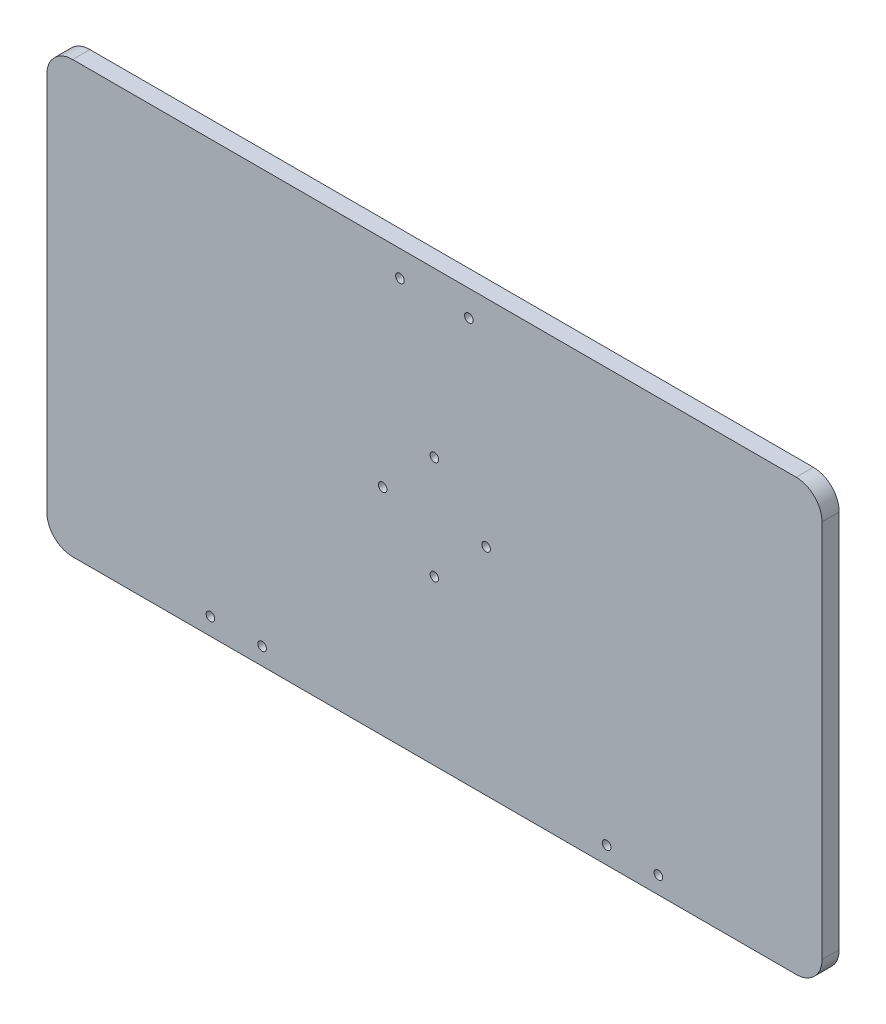
ISO-10303-21;
HEADER;
FILE_DESCRIPTION(('STEP AP214'),'2;1');
FILE_NAME('part.step','',(''),(''),'','','');
FILE_SCHEMA(('AUTOMOTIVE_DESIGN { 1 0 10303 214 1 1 1 1 }'));
ENDSEC;
DATA;
#1=APPLICATION_CONTEXT('core data for automotive mechanical design processes');
#2=APPLICATION_PROTOCOL_DEFINITION('international standard','automotive_design',2000,#1);
#3=PRODUCT_CONTEXT('',#1,'mechanical');
#4=PRODUCT('Part','Part','',(#3));
#5=PRODUCT_RELATED_PRODUCT_CATEGORY('part','',(#4));
#6=PRODUCT_DEFINITION_FORMATION('','',#4);
#7=PRODUCT_DEFINITION_CONTEXT('part definition',#1,'design');
#8=PRODUCT_DEFINITION('design','',#6,#7);
#9=PRODUCT_DEFINITION_SHAPE('','',#8);
#10=(LENGTH_UNIT() NAMED_UNIT(*) SI_UNIT(.MILLI.,.METRE.));
#11=(NAMED_UNIT(*) PLANE_ANGLE_UNIT() SI_UNIT($,.RADIAN.));
#12=(NAMED_UNIT(*) SI_UNIT($,.STERADIAN.) SOLID_ANGLE_UNIT());
#13=UNCERTAINTY_MEASURE_WITH_UNIT(LENGTH_MEASURE(1.E-05),#10,'distance_accuracy_value','');
#14=(GEOMETRIC_REPRESENTATION_CONTEXT(3) GLOBAL_UNCERTAINTY_ASSIGNED_CONTEXT((#13)) GLOBAL_UNIT_ASSIGNED_CONTEXT((#10,
#11,#12)) REPRESENTATION_CONTEXT('',''));
#15=CARTESIAN_POINT('',(0.,0.,0.));
#16=DIRECTION('',(0.,0.,1.));
#17=DIRECTION('',(1.,0.,0.));
#18=AXIS2_PLACEMENT_3D('',#15,#16,#17);
#19=CARTESIAN_POINT('',(435.,235.,10.));
#20=DIRECTION('',(0.,0.,-1.));
#21=DIRECTION('',(-1.,0.,0.));
#22=AXIS2_PLACEMENT_3D('',#19,#20,#21);
#23=PLANE('',#22);
#24=CARTESIAN_POINT('',(435.,235.,10.));
#25=DIRECTION('',(0.,0.,1.));
#26=DIRECTION('',(-1.,0.,0.));
#27=AXIS2_PLACEMENT_3D('',#24,#25,#26);
#28=CIRCLE('',#27,15.);
#29=CARTESIAN_POINT('',(450.,235.,10.));
#30=VERTEX_POINT('',#29);
#31=CARTESIAN_POINT('',(435.,250.,10.));
#32=VERTEX_POINT('',#31);
#33=EDGE_CURVE('E146',#30,#32,#28,.T.);
#34=ORIENTED_EDGE('',*,*,#33,.T.);
#35=DIRECTION('',(-1.,0.,0.));
#36=VECTOR('',#35,1.);
#37=CARTESIAN_POINT('',(15.,250.,10.));
#38=LINE('',#37,#36);
#39=CARTESIAN_POINT('',(15.,250.,10.));
#40=VERTEX_POINT('',#39);
#41=EDGE_CURVE('E94',#32,#40,#38,.T.);
#42=ORIENTED_EDGE('',*,*,#41,.T.);
#43=CARTESIAN_POINT('',(15.,235.,10.));
#44=DIRECTION('',(0.,0.,1.));
#45=DIRECTION('',(-1.,0.,0.));
#46=AXIS2_PLACEMENT_3D('',#43,#44,#45);
#47=CIRCLE('',#46,15.);
#48=CARTESIAN_POINT('',(0.,235.,10.));
#49=VERTEX_POINT('',#48);
#50=EDGE_CURVE('E161',#40,#49,#47,.T.);
#51=ORIENTED_EDGE('',*,*,#50,.T.);
#52=DIRECTION('',(0.,-1.,0.));
#53=VECTOR('',#52,1.);
#54=CARTESIAN_POINT('',(0.,15.0000000000001,10.));
#55=LINE('',#54,#53);
#56=CARTESIAN_POINT('',(0.,15.0000000000001,10.));
#57=VERTEX_POINT('',#56);
#58=EDGE_CURVE('E174',#49,#57,#55,.T.);
#59=ORIENTED_EDGE('',*,*,#58,.T.);
#60=CARTESIAN_POINT('',(15.,15.,10.));
#61=DIRECTION('',(0.,0.,1.));
#62=DIRECTION('',(-1.,0.,0.));
#63=AXIS2_PLACEMENT_3D('',#60,#61,#62);
#64=CIRCLE('',#63,15.);
#65=CARTESIAN_POINT('',(15.0000000000001,0.,10.));
#66=VERTEX_POINT('',#65);
#67=EDGE_CURVE('E113',#57,#66,#64,.T.);
#68=ORIENTED_EDGE('',*,*,#67,.T.);
#69=DIRECTION('',(1.,0.,0.));
#70=VECTOR('',#69,1.);
#71=CARTESIAN_POINT('',(15.0000000000001,0.,10.));
#72=LINE('',#71,#70);
#73=CARTESIAN_POINT('',(435.,0.,10.));
#74=VERTEX_POINT('',#73);
#75=EDGE_CURVE('E107',#66,#74,#72,.T.);
#76=ORIENTED_EDGE('',*,*,#75,.T.);
#77=CARTESIAN_POINT('',(435.,15.,10.));
#78=DIRECTION('',(0.,0.,1.));
#79=DIRECTION('',(1.,0.,0.));
#80=AXIS2_PLACEMENT_3D('',#77,#78,#79);
#81=CIRCLE('',#80,15.);
#82=CARTESIAN_POINT('',(450.,15.,10.));
#83=VERTEX_POINT('',#82);
#84=EDGE_CURVE('E111',#74,#83,#81,.T.);
#85=ORIENTED_EDGE('',*,*,#84,.T.);
#86=DIRECTION('',(0.,1.,0.));
#87=VECTOR('',#86,1.);
#88=CARTESIAN_POINT('',(450.,15.,10.));
#89=LINE('',#88,#87);
#90=EDGE_CURVE('E51',#83,#30,#89,.T.);
#91=ORIENTED_EDGE('',*,*,#90,.T.);
#92=EDGE_LOOP('',(#34,#42,#51,#59,#68,#76,#85,#91));
#93=FACE_BOUND('',#92,.T.);
#94=CARTESIAN_POINT('',(255.,125.,10.));
#95=DIRECTION('',(0.,0.,1.));
#96=DIRECTION('',(1.,0.,0.));
#97=AXIS2_PLACEMENT_3D('',#94,#95,#96);
#98=CIRCLE('',#97,2.50000000000002);
#99=CARTESIAN_POINT('',(257.5,125.,10.));
#100=VERTEX_POINT('',#99);
#101=EDGE_CURVE('E135',#100,#100,#98,.T.);
#102=ORIENTED_EDGE('',*,*,#101,.F.);
#103=EDGE_LOOP('',(#102));
#104=FACE_BOUND('',#103,.T.);
#105=CARTESIAN_POINT('',(225.,95.,10.));
#106=DIRECTION('',(0.,0.,1.));
#107=DIRECTION('',(1.,0.,0.));
#108=AXIS2_PLACEMENT_3D('',#105,#106,#107);
#109=CIRCLE('',#108,2.50000000000002);
#110=CARTESIAN_POINT('',(227.5,95.,10.));
#111=VERTEX_POINT('',#110);
#112=EDGE_CURVE('E183',#111,#111,#109,.T.);
#113=ORIENTED_EDGE('',*,*,#112,.F.);
#114=EDGE_LOOP('',(#113));
#115=FACE_BOUND('',#114,.T.);
#116=CARTESIAN_POINT('',(195.,125.,10.));
#117=DIRECTION('',(0.,0.,1.));
#118=DIRECTION('',(1.,0.,0.));
#119=AXIS2_PLACEMENT_3D('',#116,#117,#118);
#120=CIRCLE('',#119,2.50000000000001);
#121=CARTESIAN_POINT('',(197.5,125.,10.));
#122=VERTEX_POINT('',#121);
#123=EDGE_CURVE('E189',#122,#122,#120,.T.);
#124=ORIENTED_EDGE('',*,*,#123,.F.);
#125=EDGE_LOOP('',(#124));
#126=FACE_BOUND('',#125,.T.);
#127=CARTESIAN_POINT('',(225.,155.,10.));
#128=DIRECTION('',(0.,0.,1.));
#129=DIRECTION('',(1.,0.,0.));
#130=AXIS2_PLACEMENT_3D('',#127,#128,#129);
#131=CIRCLE('',#130,2.50000000000001);
#132=CARTESIAN_POINT('',(227.5,155.,10.));
#133=VERTEX_POINT('',#132);
#134=EDGE_CURVE('E195',#133,#133,#131,.T.);
#135=ORIENTED_EDGE('',*,*,#134,.F.);
#136=EDGE_LOOP('',(#135));
#137=FACE_BOUND('',#136,.T.);
#138=CARTESIAN_POINT('',(125.,10.,10.));
#139=DIRECTION('',(0.,0.,1.));
#140=DIRECTION('',(1.,0.,0.));
#141=AXIS2_PLACEMENT_3D('',#138,#139,#140);
#142=CIRCLE('',#141,2.5);
#143=CARTESIAN_POINT('',(127.5,10.,10.));
#144=VERTEX_POINT('',#143);
#145=EDGE_CURVE('E201',#144,#144,#142,.T.);
#146=ORIENTED_EDGE('',*,*,#145,.F.);
#147=EDGE_LOOP('',(#146));
#148=FACE_BOUND('',#147,.T.);
#149=CARTESIAN_POINT('',(95.,10.,10.));
#150=DIRECTION('',(0.,0.,1.));
#151=DIRECTION('',(1.,0.,0.));
#152=AXIS2_PLACEMENT_3D('',#149,#150,#151);
#153=CIRCLE('',#152,2.5);
#154=CARTESIAN_POINT('',(97.5,10.,10.));
#155=VERTEX_POINT('',#154);
#156=EDGE_CURVE('E207',#155,#155,#153,.T.);
#157=ORIENTED_EDGE('',*,*,#156,.F.);
#158=EDGE_LOOP('',(#157));
#159=FACE_BOUND('',#158,.T.);
#160=CARTESIAN_POINT('',(355.,10.0000000000001,10.));
#161=DIRECTION('',(0.,0.,1.));
#162=DIRECTION('',(-1.,0.,0.));
#163=AXIS2_PLACEMENT_3D('',#160,#161,#162);
#164=CIRCLE('',#163,2.50000000000002);
#165=CARTESIAN_POINT('',(352.5,10.0000000000001,10.));
#166=VERTEX_POINT('',#165);
#167=EDGE_CURVE('E213',#166,#166,#164,.T.);
#168=ORIENTED_EDGE('',*,*,#167,.F.);
#169=EDGE_LOOP('',(#168));
#170=FACE_BOUND('',#169,.T.);
#171=CARTESIAN_POINT('',(325.,10.0000000000001,10.));
#172=DIRECTION('',(0.,0.,1.));
#173=DIRECTION('',(-1.,0.,0.));
#174=AXIS2_PLACEMENT_3D('',#171,#172,#173);
#175=CIRCLE('',#174,2.50000000000002);
#176=CARTESIAN_POINT('',(322.5,10.0000000000001,10.));
#177=VERTEX_POINT('',#176);
#178=EDGE_CURVE('E219',#177,#177,#175,.T.);
#179=ORIENTED_EDGE('',*,*,#178,.F.);
#180=EDGE_LOOP('',(#179));
#181=FACE_BOUND('',#180,.T.);
#182=CARTESIAN_POINT('',(245.,235.,10.));
#183=DIRECTION('',(0.,0.,1.));
#184=DIRECTION('',(1.,0.,0.));
#185=AXIS2_PLACEMENT_3D('',#182,#183,#184);
#186=CIRCLE('',#185,2.5);
#187=CARTESIAN_POINT('',(247.5,235.,10.));
#188=VERTEX_POINT('',#187);
#189=EDGE_CURVE('E225',#188,#188,#186,.T.);
#190=ORIENTED_EDGE('',*,*,#189,.F.);
#191=EDGE_LOOP('',(#190));
#192=FACE_BOUND('',#191,.T.);
#193=CARTESIAN_POINT('',(205.,235.,10.));
#194=DIRECTION('',(0.,0.,1.));
#195=DIRECTION('',(1.,0.,0.));
#196=AXIS2_PLACEMENT_3D('',#193,#194,#195);
#197=CIRCLE('',#196,2.5);
#198=CARTESIAN_POINT('',(207.5,235.,10.));
#199=VERTEX_POINT('',#198);
#200=EDGE_CURVE('E231',#199,#199,#197,.T.);
#201=ORIENTED_EDGE('',*,*,#200,.F.);
#202=EDGE_LOOP('',(#201));
#203=FACE_BOUND('',#202,.T.);
#204=ADVANCED_FACE('F34',(#93,#104,#115,#126,#137,#148,#159,#170,#181,#192,#203),#23,.F.);
#205=CARTESIAN_POINT('',(435.,235.,0.));
#206=DIRECTION('',(0.,0.,-1.));
#207=DIRECTION('',(-1.,0.,0.));
#208=AXIS2_PLACEMENT_3D('',#205,#206,#207);
#209=PLANE('',#208);
#210=CARTESIAN_POINT('',(245.,235.,0.));
#211=DIRECTION('',(0.,0.,1.));
#212=DIRECTION('',(1.,0.,0.));
#213=AXIS2_PLACEMENT_3D('',#210,#211,#212);
#214=CIRCLE('',#213,2.5);
#215=CARTESIAN_POINT('',(247.5,235.,0.));
#216=VERTEX_POINT('',#215);
#217=EDGE_CURVE('E228',#216,#216,#214,.T.);
#218=ORIENTED_EDGE('',*,*,#217,.T.);
#219=EDGE_LOOP('',(#218));
#220=FACE_BOUND('',#219,.T.);
#221=CARTESIAN_POINT('',(355.,10.0000000000001,0.));
#222=DIRECTION('',(0.,0.,1.));
#223=DIRECTION('',(-1.,0.,0.));
#224=AXIS2_PLACEMENT_3D('',#221,#222,#223);
#225=CIRCLE('',#224,2.50000000000002);
#226=CARTESIAN_POINT('',(352.5,10.0000000000001,0.));
#227=VERTEX_POINT('',#226);
#228=EDGE_CURVE('E216',#227,#227,#225,.T.);
#229=ORIENTED_EDGE('',*,*,#228,.T.);
#230=EDGE_LOOP('',(#229));
#231=FACE_BOUND('',#230,.T.);
#232=CARTESIAN_POINT('',(125.,10.,0.));
#233=DIRECTION('',(0.,0.,1.));
#234=DIRECTION('',(1.,0.,0.));
#235=AXIS2_PLACEMENT_3D('',#232,#233,#234);
#236=CIRCLE('',#235,2.5);
#237=CARTESIAN_POINT('',(127.5,10.,0.));
#238=VERTEX_POINT('',#237);
#239=EDGE_CURVE('E204',#238,#238,#236,.T.);
#240=ORIENTED_EDGE('',*,*,#239,.T.);
#241=EDGE_LOOP('',(#240));
#242=FACE_BOUND('',#241,.T.);
#243=CARTESIAN_POINT('',(195.,125.,0.));
#244=DIRECTION('',(0.,0.,1.));
#245=DIRECTION('',(1.,0.,0.));
#246=AXIS2_PLACEMENT_3D('',#243,#244,#245);
#247=CIRCLE('',#246,2.50000000000001);
#248=CARTESIAN_POINT('',(197.5,125.,0.));
#249=VERTEX_POINT('',#248);
#250=EDGE_CURVE('E192',#249,#249,#247,.T.);
#251=ORIENTED_EDGE('',*,*,#250,.T.);
#252=EDGE_LOOP('',(#251));
#253=FACE_BOUND('',#252,.T.);
#254=CARTESIAN_POINT('',(255.,125.,0.));
#255=DIRECTION('',(0.,0.,1.));
#256=DIRECTION('',(1.,0.,0.));
#257=AXIS2_PLACEMENT_3D('',#254,#255,#256);
#258=CIRCLE('',#257,2.50000000000002);
#259=CARTESIAN_POINT('',(257.5,125.,0.));
#260=VERTEX_POINT('',#259);
#261=EDGE_CURVE('E180',#260,#260,#258,.T.);
#262=ORIENTED_EDGE('',*,*,#261,.T.);
#263=EDGE_LOOP('',(#262));
#264=FACE_BOUND('',#263,.T.);
#265=CARTESIAN_POINT('',(435.,235.,0.));
#266=DIRECTION('',(0.,0.,1.));
#267=DIRECTION('',(-1.,0.,0.));
#268=AXIS2_PLACEMENT_3D('',#265,#266,#267);
#269=CIRCLE('',#268,15.);
#270=CARTESIAN_POINT('',(450.,235.,0.));
#271=VERTEX_POINT('',#270);
#272=CARTESIAN_POINT('',(435.,250.,0.));
#273=VERTEX_POINT('',#272);
#274=EDGE_CURVE('E131',#271,#273,#269,.T.);
#275=ORIENTED_EDGE('',*,*,#274,.F.);
#276=DIRECTION('',(0.,1.,0.));
#277=VECTOR('',#276,1.);
#278=CARTESIAN_POINT('',(450.,15.,0.));
#279=LINE('',#278,#277);
#280=CARTESIAN_POINT('',(450.,15.,0.));
#281=VERTEX_POINT('',#280);
#282=EDGE_CURVE('E86',#281,#271,#279,.T.);
#283=ORIENTED_EDGE('',*,*,#282,.F.);
#284=CARTESIAN_POINT('',(435.,15.,0.));
#285=DIRECTION('',(0.,0.,1.));
#286=DIRECTION('',(1.,0.,0.));
#287=AXIS2_PLACEMENT_3D('',#284,#285,#286);
#288=CIRCLE('',#287,15.);
#289=CARTESIAN_POINT('',(435.,0.,0.));
#290=VERTEX_POINT('',#289);
#291=EDGE_CURVE('E80',#290,#281,#288,.T.);
#292=ORIENTED_EDGE('',*,*,#291,.F.);
#293=DIRECTION('',(1.,0.,0.));
#294=VECTOR('',#293,1.);
#295=CARTESIAN_POINT('',(15.0000000000001,0.,0.));
#296=LINE('',#295,#294);
#297=CARTESIAN_POINT('',(15.0000000000001,0.,0.));
#298=VERTEX_POINT('',#297);
#299=EDGE_CURVE('E121',#298,#290,#296,.T.);
#300=ORIENTED_EDGE('',*,*,#299,.F.);
#301=CARTESIAN_POINT('',(15.,15.,0.));
#302=DIRECTION('',(0.,0.,1.));
#303=DIRECTION('',(-1.,0.,0.));
#304=AXIS2_PLACEMENT_3D('',#301,#302,#303);
#305=CIRCLE('',#304,15.);
#306=CARTESIAN_POINT('',(0.,15.0000000000001,0.));
#307=VERTEX_POINT('',#306);
#308=EDGE_CURVE('E141',#307,#298,#305,.T.);
#309=ORIENTED_EDGE('',*,*,#308,.F.);
#310=DIRECTION('',(0.,-1.,0.));
#311=VECTOR('',#310,1.);
#312=CARTESIAN_POINT('',(0.,15.0000000000001,0.));
#313=LINE('',#312,#311);
#314=CARTESIAN_POINT('',(0.,235.,0.));
#315=VERTEX_POINT('',#314);
#316=EDGE_CURVE('E139',#315,#307,#313,.T.);
#317=ORIENTED_EDGE('',*,*,#316,.F.);
#318=CARTESIAN_POINT('',(15.,235.,0.));
#319=DIRECTION('',(0.,0.,1.));
#320=DIRECTION('',(-1.,0.,0.));
#321=AXIS2_PLACEMENT_3D('',#318,#319,#320);
#322=CIRCLE('',#321,15.);
#323=CARTESIAN_POINT('',(15.,250.,0.));
#324=VERTEX_POINT('',#323);
#325=EDGE_CURVE('E137',#324,#315,#322,.T.);
#326=ORIENTED_EDGE('',*,*,#325,.F.);
#327=DIRECTION('',(-1.,0.,0.));
#328=VECTOR('',#327,1.);
#329=CARTESIAN_POINT('',(15.,250.,0.));
#330=LINE('',#329,#328);
#331=EDGE_CURVE('E134',#273,#324,#330,.T.);
#332=ORIENTED_EDGE('',*,*,#331,.F.);
#333=EDGE_LOOP('',(#275,#283,#292,#300,#309,#317,#326,#332));
#334=FACE_BOUND('',#333,.T.);
#335=CARTESIAN_POINT('',(225.,95.,0.));
#336=DIRECTION('',(0.,0.,1.));
#337=DIRECTION('',(1.,0.,0.));
#338=AXIS2_PLACEMENT_3D('',#335,#336,#337);
#339=CIRCLE('',#338,2.50000000000002);
#340=CARTESIAN_POINT('',(227.5,95.,0.));
#341=VERTEX_POINT('',#340);
#342=EDGE_CURVE('E186',#341,#341,#339,.T.);
#343=ORIENTED_EDGE('',*,*,#342,.T.);
#344=EDGE_LOOP('',(#343));
#345=FACE_BOUND('',#344,.T.);
#346=CARTESIAN_POINT('',(225.,155.,0.));
#347=DIRECTION('',(0.,0.,1.));
#348=DIRECTION('',(1.,0.,0.));
#349=AXIS2_PLACEMENT_3D('',#346,#347,#348);
#350=CIRCLE('',#349,2.50000000000001);
#351=CARTESIAN_POINT('',(227.5,155.,0.));
#352=VERTEX_POINT('',#351);
#353=EDGE_CURVE('E198',#352,#352,#350,.T.);
#354=ORIENTED_EDGE('',*,*,#353,.T.);
#355=EDGE_LOOP('',(#354));
#356=FACE_BOUND('',#355,.T.);
#357=CARTESIAN_POINT('',(95.,10.,0.));
#358=DIRECTION('',(0.,0.,1.));
#359=DIRECTION('',(1.,0.,0.));
#360=AXIS2_PLACEMENT_3D('',#357,#358,#359);
#361=CIRCLE('',#360,2.5);
#362=CARTESIAN_POINT('',(97.5,10.,0.));
#363=VERTEX_POINT('',#362);
#364=EDGE_CURVE('E210',#363,#363,#361,.T.);
#365=ORIENTED_EDGE('',*,*,#364,.T.);
#366=EDGE_LOOP('',(#365));
#367=FACE_BOUND('',#366,.T.);
#368=CARTESIAN_POINT('',(325.,10.0000000000001,0.));
#369=DIRECTION('',(0.,0.,1.));
#370=DIRECTION('',(-1.,0.,0.));
#371=AXIS2_PLACEMENT_3D('',#368,#369,#370);
#372=CIRCLE('',#371,2.50000000000002);
#373=CARTESIAN_POINT('',(322.5,10.0000000000001,0.));
#374=VERTEX_POINT('',#373);
#375=EDGE_CURVE('E222',#374,#374,#372,.T.);
#376=ORIENTED_EDGE('',*,*,#375,.T.);
#377=EDGE_LOOP('',(#376));
#378=FACE_BOUND('',#377,.T.);
#379=CARTESIAN_POINT('',(205.,235.,0.));
#380=DIRECTION('',(0.,0.,1.));
#381=DIRECTION('',(1.,0.,0.));
#382=AXIS2_PLACEMENT_3D('',#379,#380,#381);
#383=CIRCLE('',#382,2.5);
#384=CARTESIAN_POINT('',(207.5,235.,0.));
#385=VERTEX_POINT('',#384);
#386=EDGE_CURVE('E234',#385,#385,#383,.T.);
#387=ORIENTED_EDGE('',*,*,#386,.T.);
#388=EDGE_LOOP('',(#387));
#389=FACE_BOUND('',#388,.T.);
#390=ADVANCED_FACE('F165',(#220,#231,#242,#253,#264,#334,#345,#356,#367,#378,#389),#209,.T.);
#391=CARTESIAN_POINT('',(435.,235.,10.));
#392=DIRECTION('',(0.,0.,-1.));
#393=DIRECTION('',(-1.,0.,0.));
#394=AXIS2_PLACEMENT_3D('',#391,#392,#393);
#395=CYLINDRICAL_SURFACE('',#394,15.);
#396=ORIENTED_EDGE('',*,*,#274,.T.);
#397=DIRECTION('',(0.,0.,-1.));
#398=VECTOR('',#397,1.);
#399=CARTESIAN_POINT('',(435.,250.,10.));
#400=LINE('',#399,#398);
#401=EDGE_CURVE('E11',#32,#273,#400,.T.);
#402=ORIENTED_EDGE('',*,*,#401,.F.);
#403=ORIENTED_EDGE('',*,*,#33,.F.);
#404=DIRECTION('',(0.,0.,-1.));
#405=VECTOR('',#404,1.);
#406=CARTESIAN_POINT('',(450.,235.,10.));
#407=LINE('',#406,#405);
#408=EDGE_CURVE('E127',#30,#271,#407,.T.);
#409=ORIENTED_EDGE('',*,*,#408,.T.);
#410=EDGE_LOOP('',(#396,#402,#403,#409));
#411=FACE_BOUND('',#410,.T.);
#412=ADVANCED_FACE('F36',(#411),#395,.T.);
#413=CARTESIAN_POINT('',(15.,250.,10.));
#414=DIRECTION('',(0.,-1.,0.));
#415=DIRECTION('',(0.,0.,-1.));
#416=AXIS2_PLACEMENT_3D('',#413,#414,#415);
#417=PLANE('',#416);
#418=ORIENTED_EDGE('',*,*,#331,.T.);
#419=DIRECTION('',(0.,0.,-1.));
#420=VECTOR('',#419,1.);
#421=CARTESIAN_POINT('',(15.,250.,10.));
#422=LINE('',#421,#420);
#423=EDGE_CURVE('E43',#40,#324,#422,.T.);
#424=ORIENTED_EDGE('',*,*,#423,.F.);
#425=ORIENTED_EDGE('',*,*,#41,.F.);
#426=ORIENTED_EDGE('',*,*,#401,.T.);
#427=EDGE_LOOP('',(#418,#424,#425,#426));
#428=FACE_BOUND('',#427,.T.);
#429=ADVANCED_FACE('F266',(#428),#417,.F.);
#430=CARTESIAN_POINT('',(15.,235.,10.));
#431=DIRECTION('',(0.,0.,-1.));
#432=DIRECTION('',(-1.,0.,0.));
#433=AXIS2_PLACEMENT_3D('',#430,#431,#432);
#434=CYLINDRICAL_SURFACE('',#433,15.);
#435=ORIENTED_EDGE('',*,*,#325,.T.);
#436=DIRECTION('',(0.,0.,-1.));
#437=VECTOR('',#436,1.);
#438=CARTESIAN_POINT('',(0.,235.,10.));
#439=LINE('',#438,#437);
#440=EDGE_CURVE('E153',#49,#315,#439,.T.);
#441=ORIENTED_EDGE('',*,*,#440,.F.);
#442=ORIENTED_EDGE('',*,*,#50,.F.);
#443=ORIENTED_EDGE('',*,*,#423,.T.);
#444=EDGE_LOOP('',(#435,#441,#442,#443));
#445=FACE_BOUND('',#444,.T.);
#446=ADVANCED_FACE('F159',(#445),#434,.T.);
#447=CARTESIAN_POINT('',(0.,15.0000000000001,10.));
#448=DIRECTION('',(1.,0.,0.));
#449=DIRECTION('',(0.,0.,-1.));
#450=AXIS2_PLACEMENT_3D('',#447,#448,#449);
#451=PLANE('',#450);
#452=ORIENTED_EDGE('',*,*,#316,.T.);
#453=DIRECTION('',(0.,0.,-1.));
#454=VECTOR('',#453,1.);
#455=CARTESIAN_POINT('',(0.,15.0000000000001,10.));
#456=LINE('',#455,#454);
#457=EDGE_CURVE('E150',#57,#307,#456,.T.);
#458=ORIENTED_EDGE('',*,*,#457,.F.);
#459=ORIENTED_EDGE('',*,*,#58,.F.);
#460=ORIENTED_EDGE('',*,*,#440,.T.);
#461=EDGE_LOOP('',(#452,#458,#459,#460));
#462=FACE_BOUND('',#461,.T.);
#463=ADVANCED_FACE('F170',(#462),#451,.F.);
#464=CARTESIAN_POINT('',(15.,15.,10.));
#465=DIRECTION('',(0.,0.,-1.));
#466=DIRECTION('',(-1.,0.,0.));
#467=AXIS2_PLACEMENT_3D('',#464,#465,#466);
#468=CYLINDRICAL_SURFACE('',#467,15.);
#469=ORIENTED_EDGE('',*,*,#308,.T.);
#470=DIRECTION('',(0.,0.,-1.));
#471=VECTOR('',#470,1.);
#472=CARTESIAN_POINT('',(15.0000000000001,0.,10.));
#473=LINE('',#472,#471);
#474=EDGE_CURVE('E122',#66,#298,#473,.T.);
#475=ORIENTED_EDGE('',*,*,#474,.F.);
#476=ORIENTED_EDGE('',*,*,#67,.F.);
#477=ORIENTED_EDGE('',*,*,#457,.T.);
#478=EDGE_LOOP('',(#469,#475,#476,#477));
#479=FACE_BOUND('',#478,.T.);
#480=ADVANCED_FACE('F173',(#479),#468,.T.);
#481=CARTESIAN_POINT('',(15.0000000000001,0.,10.));
#482=DIRECTION('',(0.,1.,0.));
#483=DIRECTION('',(-1.,0.,0.));
#484=AXIS2_PLACEMENT_3D('',#481,#482,#483);
#485=PLANE('',#484);
#486=ORIENTED_EDGE('',*,*,#299,.T.);
#487=DIRECTION('',(0.,0.,-1.));
#488=VECTOR('',#487,1.);
#489=CARTESIAN_POINT('',(435.,0.,10.));
#490=LINE('',#489,#488);
#491=EDGE_CURVE('E118',#74,#290,#490,.T.);
#492=ORIENTED_EDGE('',*,*,#491,.F.);
#493=ORIENTED_EDGE('',*,*,#75,.F.);
#494=ORIENTED_EDGE('',*,*,#474,.T.);
#495=EDGE_LOOP('',(#486,#492,#493,#494));
#496=FACE_BOUND('',#495,.T.);
#497=ADVANCED_FACE('F119',(#496),#485,.F.);
#498=CARTESIAN_POINT('',(435.,15.,10.));
#499=DIRECTION('',(0.,0.,-1.));
#500=DIRECTION('',(-1.,0.,0.));
#501=AXIS2_PLACEMENT_3D('',#498,#499,#500);
#502=CYLINDRICAL_SURFACE('',#501,15.);
#503=ORIENTED_EDGE('',*,*,#291,.T.);
#504=DIRECTION('',(0.,0.,-1.));
#505=VECTOR('',#504,1.);
#506=CARTESIAN_POINT('',(450.,15.,10.));
#507=LINE('',#506,#505);
#508=EDGE_CURVE('E123',#83,#281,#507,.T.);
#509=ORIENTED_EDGE('',*,*,#508,.F.);
#510=ORIENTED_EDGE('',*,*,#84,.F.);
#511=ORIENTED_EDGE('',*,*,#491,.T.);
#512=EDGE_LOOP('',(#503,#509,#510,#511));
#513=FACE_BOUND('',#512,.T.);
#514=ADVANCED_FACE('F125',(#513),#502,.T.);
#515=CARTESIAN_POINT('',(450.,15.,10.));
#516=DIRECTION('',(-1.,0.,0.));
#517=DIRECTION('',(0.,0.,1.));
#518=AXIS2_PLACEMENT_3D('',#515,#516,#517);
#519=PLANE('',#518);
#520=ORIENTED_EDGE('',*,*,#282,.T.);
#521=ORIENTED_EDGE('',*,*,#408,.F.);
#522=ORIENTED_EDGE('',*,*,#90,.F.);
#523=ORIENTED_EDGE('',*,*,#508,.T.);
#524=EDGE_LOOP('',(#520,#521,#522,#523));
#525=FACE_BOUND('',#524,.T.);
#526=ADVANCED_FACE('F254',(#525),#519,.F.);
#527=CARTESIAN_POINT('',(255.,125.,10.));
#528=DIRECTION('',(0.,0.,-1.));
#529=DIRECTION('',(-1.,0.,0.));
#530=AXIS2_PLACEMENT_3D('',#527,#528,#529);
#531=CYLINDRICAL_SURFACE('',#530,2.50000000000002);
#532=ORIENTED_EDGE('',*,*,#101,.T.);
#533=EDGE_LOOP('',(#532));
#534=FACE_BOUND('',#533,.T.);
#535=ORIENTED_EDGE('',*,*,#261,.F.);
#536=EDGE_LOOP('',(#535));
#537=FACE_BOUND('',#536,.T.);
#538=ADVANCED_FACE('F251',(#534,#537),#531,.F.);
#539=CARTESIAN_POINT('',(225.,95.,10.));
#540=DIRECTION('',(0.,0.,-1.));
#541=DIRECTION('',(-1.,0.,0.));
#542=AXIS2_PLACEMENT_3D('',#539,#540,#541);
#543=CYLINDRICAL_SURFACE('',#542,2.50000000000002);
#544=ORIENTED_EDGE('',*,*,#112,.T.);
#545=EDGE_LOOP('',(#544));
#546=FACE_BOUND('',#545,.T.);
#547=ORIENTED_EDGE('',*,*,#342,.F.);
#548=EDGE_LOOP('',(#547));
#549=FACE_BOUND('',#548,.T.);
#550=ADVANCED_FACE('F330',(#546,#549),#543,.F.);
#551=CARTESIAN_POINT('',(195.,125.,10.));
#552=DIRECTION('',(0.,0.,-1.));
#553=DIRECTION('',(-1.,0.,0.));
#554=AXIS2_PLACEMENT_3D('',#551,#552,#553);
#555=CYLINDRICAL_SURFACE('',#554,2.50000000000001);
#556=ORIENTED_EDGE('',*,*,#123,.T.);
#557=EDGE_LOOP('',(#556));
#558=FACE_BOUND('',#557,.T.);
#559=ORIENTED_EDGE('',*,*,#250,.F.);
#560=EDGE_LOOP('',(#559));
#561=FACE_BOUND('',#560,.T.);
#562=ADVANCED_FACE('F338',(#558,#561),#555,.F.);
#563=CARTESIAN_POINT('',(225.,155.,10.));
#564=DIRECTION('',(0.,0.,-1.));
#565=DIRECTION('',(-1.,0.,0.));
#566=AXIS2_PLACEMENT_3D('',#563,#564,#565);
#567=CYLINDRICAL_SURFACE('',#566,2.50000000000001);
#568=ORIENTED_EDGE('',*,*,#134,.T.);
#569=EDGE_LOOP('',(#568));
#570=FACE_BOUND('',#569,.T.);
#571=ORIENTED_EDGE('',*,*,#353,.F.);
#572=EDGE_LOOP('',(#571));
#573=FACE_BOUND('',#572,.T.);
#574=ADVANCED_FACE('F346',(#570,#573),#567,.F.);
#575=CARTESIAN_POINT('',(125.,10.,10.));
#576=DIRECTION('',(0.,0.,-1.));
#577=DIRECTION('',(-1.,0.,0.));
#578=AXIS2_PLACEMENT_3D('',#575,#576,#577);
#579=CYLINDRICAL_SURFACE('',#578,2.5);
#580=ORIENTED_EDGE('',*,*,#145,.T.);
#581=EDGE_LOOP('',(#580));
#582=FACE_BOUND('',#581,.T.);
#583=ORIENTED_EDGE('',*,*,#239,.F.);
#584=EDGE_LOOP('',(#583));
#585=FACE_BOUND('',#584,.T.);
#586=ADVANCED_FACE('F355',(#582,#585),#579,.F.);
#587=CARTESIAN_POINT('',(95.,10.,10.));
#588=DIRECTION('',(0.,0.,-1.));
#589=DIRECTION('',(-1.,0.,0.));
#590=AXIS2_PLACEMENT_3D('',#587,#588,#589);
#591=CYLINDRICAL_SURFACE('',#590,2.5);
#592=ORIENTED_EDGE('',*,*,#156,.T.);
#593=EDGE_LOOP('',(#592));
#594=FACE_BOUND('',#593,.T.);
#595=ORIENTED_EDGE('',*,*,#364,.F.);
#596=EDGE_LOOP('',(#595));
#597=FACE_BOUND('',#596,.T.);
#598=ADVANCED_FACE('F364',(#594,#597),#591,.F.);
#599=CARTESIAN_POINT('',(355.,10.0000000000001,10.));
#600=DIRECTION('',(0.,0.,-1.));
#601=DIRECTION('',(-1.,0.,0.));
#602=AXIS2_PLACEMENT_3D('',#599,#600,#601);
#603=CYLINDRICAL_SURFACE('',#602,2.50000000000002);
#604=ORIENTED_EDGE('',*,*,#167,.T.);
#605=EDGE_LOOP('',(#604));
#606=FACE_BOUND('',#605,.T.);
#607=ORIENTED_EDGE('',*,*,#228,.F.);
#608=EDGE_LOOP('',(#607));
#609=FACE_BOUND('',#608,.T.);
#610=ADVANCED_FACE('F373',(#606,#609),#603,.F.);
#611=CARTESIAN_POINT('',(325.,10.0000000000001,10.));
#612=DIRECTION('',(0.,0.,-1.));
#613=DIRECTION('',(-1.,0.,0.));
#614=AXIS2_PLACEMENT_3D('',#611,#612,#613);
#615=CYLINDRICAL_SURFACE('',#614,2.50000000000002);
#616=ORIENTED_EDGE('',*,*,#178,.T.);
#617=EDGE_LOOP('',(#616));
#618=FACE_BOUND('',#617,.T.);
#619=ORIENTED_EDGE('',*,*,#375,.F.);
#620=EDGE_LOOP('',(#619));
#621=FACE_BOUND('',#620,.T.);
#622=ADVANCED_FACE('F382',(#618,#621),#615,.F.);
#623=CARTESIAN_POINT('',(245.,235.,10.));
#624=DIRECTION('',(0.,0.,-1.));
#625=DIRECTION('',(-1.,0.,0.));
#626=AXIS2_PLACEMENT_3D('',#623,#624,#625);
#627=CYLINDRICAL_SURFACE('',#626,2.5);
#628=ORIENTED_EDGE('',*,*,#189,.T.);
#629=EDGE_LOOP('',(#628));
#630=FACE_BOUND('',#629,.T.);
#631=ORIENTED_EDGE('',*,*,#217,.F.);
#632=EDGE_LOOP('',(#631));
#633=FACE_BOUND('',#632,.T.);
#634=ADVANCED_FACE('F391',(#630,#633),#627,.F.);
#635=CARTESIAN_POINT('',(205.,235.,10.));
#636=DIRECTION('',(0.,0.,-1.));
#637=DIRECTION('',(-1.,0.,0.));
#638=AXIS2_PLACEMENT_3D('',#635,#636,#637);
#639=CYLINDRICAL_SURFACE('',#638,2.5);
#640=ORIENTED_EDGE('',*,*,#200,.T.);
#641=EDGE_LOOP('',(#640));
#642=FACE_BOUND('',#641,.T.);
#643=ORIENTED_EDGE('',*,*,#386,.F.);
#644=EDGE_LOOP('',(#643));
#645=FACE_BOUND('',#644,.T.);
#646=ADVANCED_FACE('F240',(#642,#645),#639,.F.);
#647=CLOSED_SHELL('',(#204,#390,#412,#429,#446,#463,#480,#497,#514,#526,#538,#550,#562,#574,
#586,#598,#610,#622,#634,#646));
#648=MANIFOLD_SOLID_BREP('B2',#647);
#649=ADVANCED_BREP_SHAPE_REPRESENTATION('',(#18,#648),#14);
#650=SHAPE_DEFINITION_REPRESENTATION(#9,#649);
ENDSEC;
END-ISO-10303-21;
